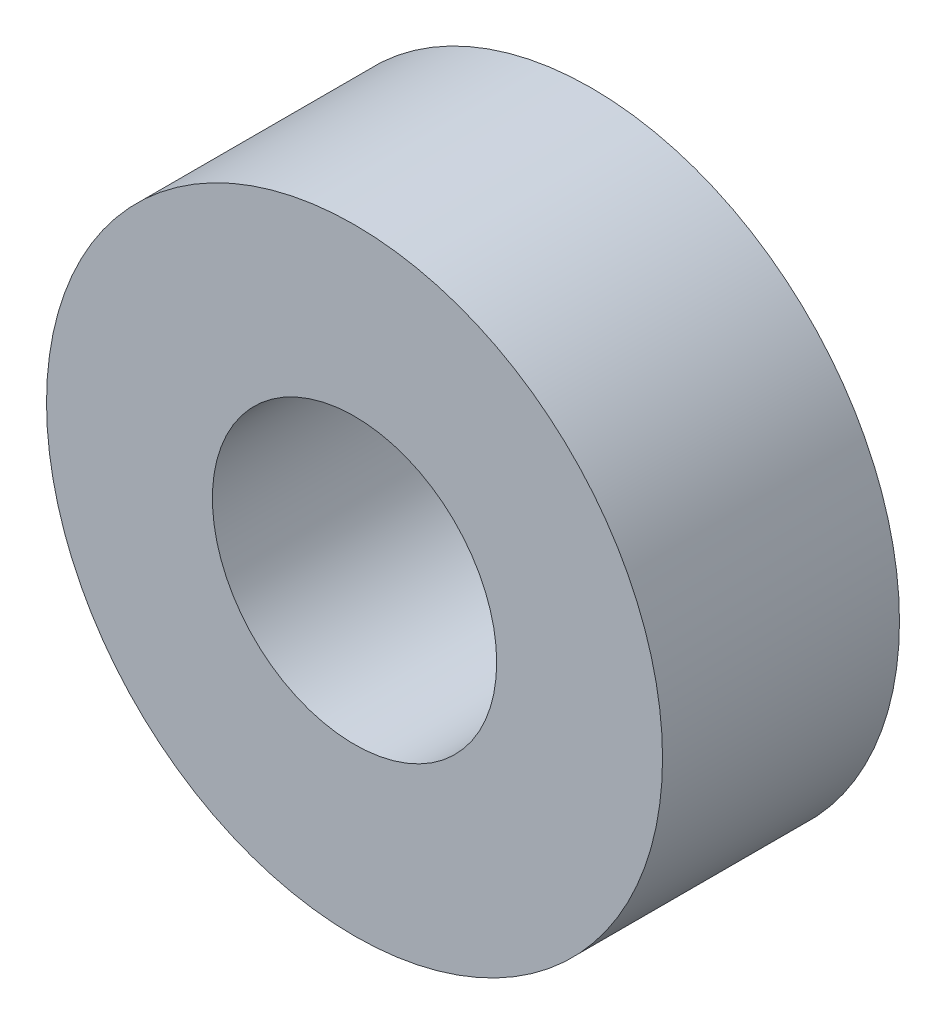
ISO-10303-21;
HEADER;
FILE_DESCRIPTION(('STEP AP214'),'2;1');
FILE_NAME('part.step','',(''),(''),'','','');
FILE_SCHEMA(('AUTOMOTIVE_DESIGN { 1 0 10303 214 1 1 1 1 }'));
ENDSEC;
DATA;
#1=APPLICATION_CONTEXT('core data for automotive mechanical design processes');
#2=APPLICATION_PROTOCOL_DEFINITION('international standard','automotive_design',2000,#1);
#3=PRODUCT_CONTEXT('',#1,'mechanical');
#4=PRODUCT('Part','Part','',(#3));
#5=PRODUCT_RELATED_PRODUCT_CATEGORY('part','',(#4));
#6=PRODUCT_DEFINITION_FORMATION('','',#4);
#7=PRODUCT_DEFINITION_CONTEXT('part definition',#1,'design');
#8=PRODUCT_DEFINITION('design','',#6,#7);
#9=PRODUCT_DEFINITION_SHAPE('','',#8);
#10=(LENGTH_UNIT() NAMED_UNIT(*) SI_UNIT(.MILLI.,.METRE.));
#11=(NAMED_UNIT(*) PLANE_ANGLE_UNIT() SI_UNIT($,.RADIAN.));
#12=(NAMED_UNIT(*) SI_UNIT($,.STERADIAN.) SOLID_ANGLE_UNIT());
#13=UNCERTAINTY_MEASURE_WITH_UNIT(LENGTH_MEASURE(1.E-05),#10,'distance_accuracy_value','');
#14=(GEOMETRIC_REPRESENTATION_CONTEXT(3) GLOBAL_UNCERTAINTY_ASSIGNED_CONTEXT((#13)) GLOBAL_UNIT_ASSIGNED_CONTEXT((#10,
#11,#12)) REPRESENTATION_CONTEXT('',''));
#15=CARTESIAN_POINT('',(0.,0.,0.));
#16=DIRECTION('',(0.,0.,1.));
#17=DIRECTION('',(1.,0.,0.));
#18=AXIS2_PLACEMENT_3D('',#15,#16,#17);
#19=CARTESIAN_POINT('',(0.,0.,5.));
#20=DIRECTION('',(0.,0.,1.));
#21=DIRECTION('',(1.,0.,0.));
#22=AXIS2_PLACEMENT_3D('',#19,#20,#21);
#23=PLANE('',#22);
#24=CARTESIAN_POINT('',(0.,0.,5.));
#25=DIRECTION('',(0.,0.,1.));
#26=DIRECTION('',(1.,0.,0.));
#27=AXIS2_PLACEMENT_3D('',#24,#25,#26);
#28=CIRCLE('',#27,6.5);
#29=CARTESIAN_POINT('',(6.5,0.,5.));
#30=VERTEX_POINT('',#29);
#31=EDGE_CURVE('E10',#30,#30,#28,.T.);
#32=ORIENTED_EDGE('',*,*,#31,.T.);
#33=EDGE_LOOP('',(#32));
#34=FACE_BOUND('',#33,.T.);
#35=CARTESIAN_POINT('',(0.,0.,5.));
#36=DIRECTION('',(0.,0.,1.));
#37=DIRECTION('',(1.,0.,0.));
#38=AXIS2_PLACEMENT_3D('',#35,#36,#37);
#39=CIRCLE('',#38,3.);
#40=CARTESIAN_POINT('',(3.,0.,5.));
#41=VERTEX_POINT('',#40);
#42=EDGE_CURVE('E49',#41,#41,#39,.T.);
#43=ORIENTED_EDGE('',*,*,#42,.F.);
#44=EDGE_LOOP('',(#43));
#45=FACE_BOUND('',#44,.T.);
#46=ADVANCED_FACE('F39',(#34,#45),#23,.T.);
#47=CARTESIAN_POINT('',(0.,0.,0.));
#48=DIRECTION('',(0.,0.,1.));
#49=DIRECTION('',(1.,0.,0.));
#50=AXIS2_PLACEMENT_3D('',#47,#48,#49);
#51=PLANE('',#50);
#52=CARTESIAN_POINT('',(0.,0.,0.));
#53=DIRECTION('',(0.,0.,1.));
#54=DIRECTION('',(1.,0.,0.));
#55=AXIS2_PLACEMENT_3D('',#52,#53,#54);
#56=CIRCLE('',#55,6.5);
#57=CARTESIAN_POINT('',(6.5,0.,0.));
#58=VERTEX_POINT('',#57);
#59=EDGE_CURVE('E43',#58,#58,#56,.T.);
#60=ORIENTED_EDGE('',*,*,#59,.F.);
#61=EDGE_LOOP('',(#60));
#62=FACE_BOUND('',#61,.T.);
#63=CARTESIAN_POINT('',(0.,0.,0.));
#64=DIRECTION('',(0.,0.,1.));
#65=DIRECTION('',(1.,0.,0.));
#66=AXIS2_PLACEMENT_3D('',#63,#64,#65);
#67=CIRCLE('',#66,3.);
#68=CARTESIAN_POINT('',(3.,0.,0.));
#69=VERTEX_POINT('',#68);
#70=EDGE_CURVE('E55',#69,#69,#67,.T.);
#71=ORIENTED_EDGE('',*,*,#70,.T.);
#72=EDGE_LOOP('',(#71));
#73=FACE_BOUND('',#72,.T.);
#74=ADVANCED_FACE('F61',(#62,#73),#51,.F.);
#75=CARTESIAN_POINT('',(0.,0.,5.));
#76=DIRECTION('',(0.,0.,-1.));
#77=DIRECTION('',(-1.,0.,0.));
#78=AXIS2_PLACEMENT_3D('',#75,#76,#77);
#79=CYLINDRICAL_SURFACE('',#78,6.5);
#80=ORIENTED_EDGE('',*,*,#31,.F.);
#81=EDGE_LOOP('',(#80));
#82=FACE_BOUND('',#81,.T.);
#83=ORIENTED_EDGE('',*,*,#59,.T.);
#84=EDGE_LOOP('',(#83));
#85=FACE_BOUND('',#84,.T.);
#86=ADVANCED_FACE('F41',(#82,#85),#79,.T.);
#87=CARTESIAN_POINT('',(0.,0.,5.));
#88=DIRECTION('',(0.,0.,-1.));
#89=DIRECTION('',(-1.,0.,0.));
#90=AXIS2_PLACEMENT_3D('',#87,#88,#89);
#91=CYLINDRICAL_SURFACE('',#90,3.);
#92=ORIENTED_EDGE('',*,*,#42,.T.);
#93=EDGE_LOOP('',(#92));
#94=FACE_BOUND('',#93,.T.);
#95=ORIENTED_EDGE('',*,*,#70,.F.);
#96=EDGE_LOOP('',(#95));
#97=FACE_BOUND('',#96,.T.);
#98=ADVANCED_FACE('F59',(#94,#97),#91,.F.);
#99=CLOSED_SHELL('',(#46,#74,#86,#98));
#100=MANIFOLD_SOLID_BREP('B2',#99);
#101=ADVANCED_BREP_SHAPE_REPRESENTATION('',(#18,#100),#14);
#102=SHAPE_DEFINITION_REPRESENTATION(#9,#101);
ENDSEC;
END-ISO-10303-21;
